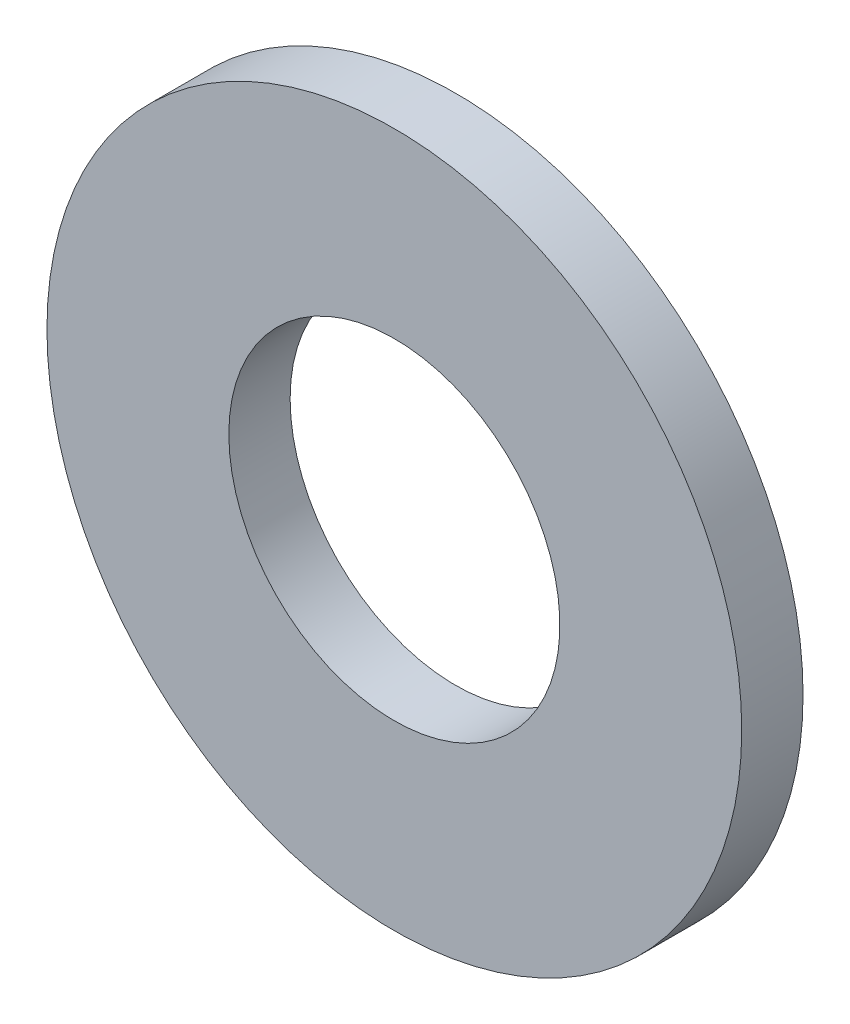
ISO-10303-21;
HEADER;
FILE_DESCRIPTION(('STEP AP214'),'2;1');
FILE_NAME('part.step','',(''),(''),'','','');
FILE_SCHEMA(('AUTOMOTIVE_DESIGN { 1 0 10303 214 1 1 1 1 }'));
ENDSEC;
DATA;
#1=APPLICATION_CONTEXT('core data for automotive mechanical design processes');
#2=APPLICATION_PROTOCOL_DEFINITION('international standard','automotive_design',2000,#1);
#3=PRODUCT_CONTEXT('',#1,'mechanical');
#4=PRODUCT('Part','Part','',(#3));
#5=PRODUCT_RELATED_PRODUCT_CATEGORY('part','',(#4));
#6=PRODUCT_DEFINITION_FORMATION('','',#4);
#7=PRODUCT_DEFINITION_CONTEXT('part definition',#1,'design');
#8=PRODUCT_DEFINITION('design','',#6,#7);
#9=PRODUCT_DEFINITION_SHAPE('','',#8);
#10=(LENGTH_UNIT() NAMED_UNIT(*) SI_UNIT(.MILLI.,.METRE.));
#11=(NAMED_UNIT(*) PLANE_ANGLE_UNIT() SI_UNIT($,.RADIAN.));
#12=(NAMED_UNIT(*) SI_UNIT($,.STERADIAN.) SOLID_ANGLE_UNIT());
#13=UNCERTAINTY_MEASURE_WITH_UNIT(LENGTH_MEASURE(1.E-05),#10,'distance_accuracy_value','');
#14=(GEOMETRIC_REPRESENTATION_CONTEXT(3) GLOBAL_UNCERTAINTY_ASSIGNED_CONTEXT((#13)) GLOBAL_UNIT_ASSIGNED_CONTEXT((#10,
#11,#12)) REPRESENTATION_CONTEXT('',''));
#15=CARTESIAN_POINT('',(0.,0.,0.));
#16=DIRECTION('',(0.,0.,1.));
#17=DIRECTION('',(1.,0.,0.));
#18=AXIS2_PLACEMENT_3D('',#15,#16,#17);
#19=CARTESIAN_POINT('',(1.62,0.,0.));
#20=DIRECTION('',(0.,0.,-1.));
#21=DIRECTION('',(-1.,0.,0.));
#22=AXIS2_PLACEMENT_3D('',#19,#20,#21);
#23=PLANE('',#22);
#24=CARTESIAN_POINT('',(0.,0.,0.));
#25=DIRECTION('',(0.,0.,-1.));
#26=DIRECTION('',(-1.,0.,0.));
#27=AXIS2_PLACEMENT_3D('',#24,#25,#26);
#28=CIRCLE('',#27,3.4);
#29=CARTESIAN_POINT('',(-3.4,0.,0.));
#30=VERTEX_POINT('',#29);
#31=EDGE_CURVE('E10',#30,#30,#28,.T.);
#32=ORIENTED_EDGE('',*,*,#31,.T.);
#33=EDGE_LOOP('',(#32));
#34=FACE_BOUND('',#33,.T.);
#35=CARTESIAN_POINT('',(0.,0.,0.));
#36=DIRECTION('',(0.,0.,-1.));
#37=DIRECTION('',(-1.,0.,0.));
#38=AXIS2_PLACEMENT_3D('',#35,#36,#37);
#39=CIRCLE('',#38,1.62);
#40=CARTESIAN_POINT('',(-1.62,0.,0.));
#41=VERTEX_POINT('',#40);
#42=EDGE_CURVE('E44',#41,#41,#39,.T.);
#43=ORIENTED_EDGE('',*,*,#42,.F.);
#44=EDGE_LOOP('',(#43));
#45=FACE_BOUND('',#44,.T.);
#46=ADVANCED_FACE('F30',(#34,#45),#23,.T.);
#47=CARTESIAN_POINT('',(0.,0.,0.6));
#48=DIRECTION('',(0.,0.,-1.));
#49=DIRECTION('',(-1.,0.,0.));
#50=AXIS2_PLACEMENT_3D('',#47,#48,#49);
#51=CYLINDRICAL_SURFACE('',#50,3.4);
#52=CARTESIAN_POINT('',(0.,0.,0.6));
#53=DIRECTION('',(0.,0.,-1.));
#54=DIRECTION('',(-1.,0.,0.));
#55=AXIS2_PLACEMENT_3D('',#52,#53,#54);
#56=CIRCLE('',#55,3.4);
#57=CARTESIAN_POINT('',(-3.4,0.,0.6));
#58=VERTEX_POINT('',#57);
#59=EDGE_CURVE('E36',#58,#58,#56,.T.);
#60=ORIENTED_EDGE('',*,*,#59,.T.);
#61=EDGE_LOOP('',(#60));
#62=FACE_BOUND('',#61,.T.);
#63=ORIENTED_EDGE('',*,*,#31,.F.);
#64=EDGE_LOOP('',(#63));
#65=FACE_BOUND('',#64,.T.);
#66=ADVANCED_FACE('F54',(#62,#65),#51,.T.);
#67=CARTESIAN_POINT('',(3.4,0.,0.6));
#68=DIRECTION('',(0.,0.,1.));
#69=DIRECTION('',(1.,0.,0.));
#70=AXIS2_PLACEMENT_3D('',#67,#68,#69);
#71=PLANE('',#70);
#72=CARTESIAN_POINT('',(0.,0.,0.6));
#73=DIRECTION('',(0.,0.,-1.));
#74=DIRECTION('',(-1.,0.,0.));
#75=AXIS2_PLACEMENT_3D('',#72,#73,#74);
#76=CIRCLE('',#75,1.62);
#77=CARTESIAN_POINT('',(-1.62,0.,0.6));
#78=VERTEX_POINT('',#77);
#79=EDGE_CURVE('E40',#78,#78,#76,.T.);
#80=ORIENTED_EDGE('',*,*,#79,.T.);
#81=EDGE_LOOP('',(#80));
#82=FACE_BOUND('',#81,.T.);
#83=ORIENTED_EDGE('',*,*,#59,.F.);
#84=EDGE_LOOP('',(#83));
#85=FACE_BOUND('',#84,.T.);
#86=ADVANCED_FACE('F58',(#82,#85),#71,.T.);
#87=CARTESIAN_POINT('',(0.,0.,0.6));
#88=DIRECTION('',(0.,0.,-1.));
#89=DIRECTION('',(-1.,0.,0.));
#90=AXIS2_PLACEMENT_3D('',#87,#88,#89);
#91=CYLINDRICAL_SURFACE('',#90,1.62);
#92=ORIENTED_EDGE('',*,*,#42,.T.);
#93=EDGE_LOOP('',(#92));
#94=FACE_BOUND('',#93,.T.);
#95=ORIENTED_EDGE('',*,*,#79,.F.);
#96=EDGE_LOOP('',(#95));
#97=FACE_BOUND('',#96,.T.);
#98=ADVANCED_FACE('F50',(#94,#97),#91,.F.);
#99=CLOSED_SHELL('',(#46,#66,#86,#98));
#100=MANIFOLD_SOLID_BREP('B2',#99);
#101=ADVANCED_BREP_SHAPE_REPRESENTATION('',(#18,#100),#14);
#102=SHAPE_DEFINITION_REPRESENTATION(#9,#101);
ENDSEC;
END-ISO-10303-21;
